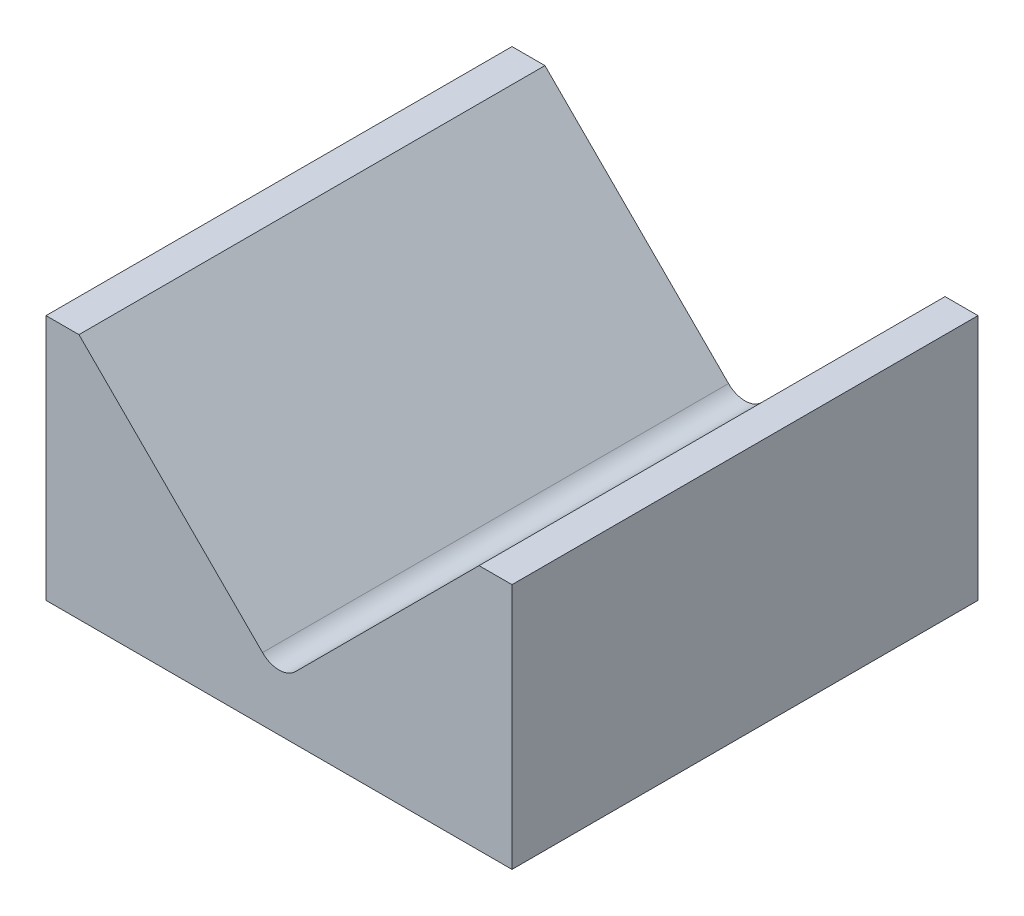
ISO-10303-21;
HEADER;
FILE_DESCRIPTION(('STEP AP214'),'2;1');
FILE_NAME('part.step','',(''),(''),'','','');
FILE_SCHEMA(('AUTOMOTIVE_DESIGN { 1 0 10303 214 1 1 1 1 }'));
ENDSEC;
DATA;
#1=APPLICATION_CONTEXT('core data for automotive mechanical design processes');
#2=APPLICATION_PROTOCOL_DEFINITION('international standard','automotive_design',2000,#1);
#3=PRODUCT_CONTEXT('',#1,'mechanical');
#4=PRODUCT('Part','Part','',(#3));
#5=PRODUCT_RELATED_PRODUCT_CATEGORY('part','',(#4));
#6=PRODUCT_DEFINITION_FORMATION('','',#4);
#7=PRODUCT_DEFINITION_CONTEXT('part definition',#1,'design');
#8=PRODUCT_DEFINITION('design','',#6,#7);
#9=PRODUCT_DEFINITION_SHAPE('','',#8);
#10=(LENGTH_UNIT() NAMED_UNIT(*) SI_UNIT(.MILLI.,.METRE.));
#11=(NAMED_UNIT(*) PLANE_ANGLE_UNIT() SI_UNIT($,.RADIAN.));
#12=(NAMED_UNIT(*) SI_UNIT($,.STERADIAN.) SOLID_ANGLE_UNIT());
#13=UNCERTAINTY_MEASURE_WITH_UNIT(LENGTH_MEASURE(1.E-05),#10,'distance_accuracy_value','');
#14=(GEOMETRIC_REPRESENTATION_CONTEXT(3) GLOBAL_UNCERTAINTY_ASSIGNED_CONTEXT((#13)) GLOBAL_UNIT_ASSIGNED_CONTEXT((#10,
#11,#12)) REPRESENTATION_CONTEXT('',''));
#15=CARTESIAN_POINT('',(0.,0.,0.));
#16=DIRECTION('',(0.,0.,1.));
#17=DIRECTION('',(1.,0.,0.));
#18=AXIS2_PLACEMENT_3D('',#15,#16,#17);
#19=CARTESIAN_POINT('',(10.,0.,10.));
#20=DIRECTION('',(0.,1.,0.));
#21=DIRECTION('',(0.,0.,1.));
#22=AXIS2_PLACEMENT_3D('',#19,#20,#21);
#23=PLANE('',#22);
#24=DIRECTION('',(1.,0.,0.));
#25=VECTOR('',#24,1.);
#26=CARTESIAN_POINT('',(10.,0.,0.));
#27=LINE('',#26,#25);
#28=CARTESIAN_POINT('',(0.,0.,0.));
#29=VERTEX_POINT('',#28);
#30=CARTESIAN_POINT('',(10.,0.,0.));
#31=VERTEX_POINT('',#30);
#32=EDGE_CURVE('E117',#29,#31,#27,.T.);
#33=ORIENTED_EDGE('',*,*,#32,.T.);
#34=DIRECTION('',(0.,0.,-1.));
#35=VECTOR('',#34,1.);
#36=CARTESIAN_POINT('',(10.,0.,10.));
#37=LINE('',#36,#35);
#38=CARTESIAN_POINT('',(10.,0.,10.));
#39=VERTEX_POINT('',#38);
#40=EDGE_CURVE('E101',#39,#31,#37,.T.);
#41=ORIENTED_EDGE('',*,*,#40,.F.);
#42=DIRECTION('',(1.,0.,0.));
#43=VECTOR('',#42,1.);
#44=CARTESIAN_POINT('',(10.,0.,10.));
#45=LINE('',#44,#43);
#46=CARTESIAN_POINT('',(0.,0.,10.));
#47=VERTEX_POINT('',#46);
#48=EDGE_CURVE('E104',#47,#39,#45,.T.);
#49=ORIENTED_EDGE('',*,*,#48,.F.);
#50=DIRECTION('',(0.,0.,-1.));
#51=VECTOR('',#50,1.);
#52=CARTESIAN_POINT('',(0.,0.,10.));
#53=LINE('',#52,#51);
#54=EDGE_CURVE('E119',#47,#29,#53,.T.);
#55=ORIENTED_EDGE('',*,*,#54,.T.);
#56=EDGE_LOOP('',(#33,#41,#49,#55));
#57=FACE_BOUND('',#56,.T.);
#58=ADVANCED_FACE('F35',(#57),#23,.F.);
#59=CARTESIAN_POINT('',(10.,6.,10.));
#60=DIRECTION('',(-1.,0.,0.));
#61=DIRECTION('',(0.,0.,1.));
#62=AXIS2_PLACEMENT_3D('',#59,#60,#61);
#63=PLANE('',#62);
#64=DIRECTION('',(0.,1.,0.));
#65=VECTOR('',#64,1.);
#66=CARTESIAN_POINT('',(10.,6.,0.));
#67=LINE('',#66,#65);
#68=CARTESIAN_POINT('',(10.,5.29289321881345,0.));
#69=VERTEX_POINT('',#68);
#70=EDGE_CURVE('E158',#31,#69,#67,.T.);
#71=ORIENTED_EDGE('',*,*,#70,.T.);
#72=DIRECTION('',(0.,0.,1.));
#73=VECTOR('',#72,1.);
#74=CARTESIAN_POINT('',(10.,5.29289321881345,10.));
#75=LINE('',#74,#73);
#76=CARTESIAN_POINT('',(10.,5.29289321881345,10.));
#77=VERTEX_POINT('',#76);
#78=EDGE_CURVE('E11',#69,#77,#75,.T.);
#79=ORIENTED_EDGE('',*,*,#78,.T.);
#80=DIRECTION('',(0.,1.,0.));
#81=VECTOR('',#80,1.);
#82=CARTESIAN_POINT('',(10.,6.,10.));
#83=LINE('',#82,#81);
#84=EDGE_CURVE('E97',#39,#77,#83,.T.);
#85=ORIENTED_EDGE('',*,*,#84,.F.);
#86=ORIENTED_EDGE('',*,*,#40,.T.);
#87=EDGE_LOOP('',(#71,#79,#85,#86));
#88=FACE_BOUND('',#87,.T.);
#89=ADVANCED_FACE('F99',(#88),#63,.F.);
#90=CARTESIAN_POINT('',(5.,1.,10.));
#91=DIRECTION('',(0.707106781186548,-0.707106781186548,0.));
#92=DIRECTION('',(0.707106781186548,0.707106781186548,0.));
#93=AXIS2_PLACEMENT_3D('',#90,#91,#92);
#94=PLANE('',#93);
#95=DIRECTION('',(-0.707106781186548,-0.707106781186548,0.));
#96=VECTOR('',#95,1.);
#97=CARTESIAN_POINT('',(5.,1.,10.));
#98=LINE('',#97,#96);
#99=CARTESIAN_POINT('',(9.29289321881345,5.29289321881345,10.));
#100=VERTEX_POINT('',#99);
#101=CARTESIAN_POINT('',(5.35355339059327,1.35355339059327,10.));
#102=VERTEX_POINT('',#101);
#103=EDGE_CURVE('E103',#100,#102,#98,.T.);
#104=ORIENTED_EDGE('',*,*,#103,.F.);
#105=DIRECTION('',(0.,0.,-1.));
#106=VECTOR('',#105,1.);
#107=CARTESIAN_POINT('',(9.29289321881345,5.29289321881345,10.));
#108=LINE('',#107,#106);
#109=CARTESIAN_POINT('',(9.29289321881345,5.29289321881345,0.));
#110=VERTEX_POINT('',#109);
#111=EDGE_CURVE('E43',#100,#110,#108,.T.);
#112=ORIENTED_EDGE('',*,*,#111,.T.);
#113=DIRECTION('',(-0.707106781186548,-0.707106781186548,0.));
#114=VECTOR('',#113,1.);
#115=CARTESIAN_POINT('',(5.,1.,0.));
#116=LINE('',#115,#114);
#117=CARTESIAN_POINT('',(5.35355339059327,1.35355339059327,0.));
#118=VERTEX_POINT('',#117);
#119=EDGE_CURVE('E150',#110,#118,#116,.T.);
#120=ORIENTED_EDGE('',*,*,#119,.T.);
#121=DIRECTION('',(0.,0.,-1.));
#122=VECTOR('',#121,1.);
#123=CARTESIAN_POINT('',(5.35355339059327,1.35355339059327,10.));
#124=LINE('',#123,#122);
#125=EDGE_CURVE('E122',#118,#102,#124,.F.);
#126=ORIENTED_EDGE('',*,*,#125,.T.);
#127=EDGE_LOOP('',(#104,#112,#120,#126));
#128=FACE_BOUND('',#127,.T.);
#129=ADVANCED_FACE('F149',(#128),#94,.F.);
#130=CARTESIAN_POINT('',(0.,6.,10.));
#131=DIRECTION('',(-0.707106781186548,-0.707106781186548,0.));
#132=DIRECTION('',(0.707106781186548,-0.707106781186548,0.));
#133=AXIS2_PLACEMENT_3D('',#130,#131,#132);
#134=PLANE('',#133);
#135=DIRECTION('',(-0.707106781186548,0.707106781186548,0.));
#136=VECTOR('',#135,1.);
#137=CARTESIAN_POINT('',(0.,6.,0.));
#138=LINE('',#137,#136);
#139=CARTESIAN_POINT('',(4.64644660940673,1.35355339059327,0.));
#140=VERTEX_POINT('',#139);
#141=CARTESIAN_POINT('',(0.707106781186552,5.29289321881345,0.));
#142=VERTEX_POINT('',#141);
#143=EDGE_CURVE('E157',#140,#142,#138,.T.);
#144=ORIENTED_EDGE('',*,*,#143,.T.);
#145=DIRECTION('',(0.,0.,1.));
#146=VECTOR('',#145,1.);
#147=CARTESIAN_POINT('',(0.707106781186552,5.29289321881345,10.));
#148=LINE('',#147,#146);
#149=CARTESIAN_POINT('',(0.707106781186552,5.29289321881345,10.));
#150=VERTEX_POINT('',#149);
#151=EDGE_CURVE('E141',#142,#150,#148,.T.);
#152=ORIENTED_EDGE('',*,*,#151,.T.);
#153=DIRECTION('',(-0.707106781186548,0.707106781186548,0.));
#154=VECTOR('',#153,1.);
#155=CARTESIAN_POINT('',(0.,6.,10.));
#156=LINE('',#155,#154);
#157=CARTESIAN_POINT('',(4.64644660940673,1.35355339059327,10.));
#158=VERTEX_POINT('',#157);
#159=EDGE_CURVE('E169',#158,#150,#156,.T.);
#160=ORIENTED_EDGE('',*,*,#159,.F.);
#161=DIRECTION('',(0.,0.,-1.));
#162=VECTOR('',#161,1.);
#163=CARTESIAN_POINT('',(4.64644660940673,1.35355339059327,0.));
#164=LINE('',#163,#162);
#165=EDGE_CURVE('E118',#158,#140,#164,.T.);
#166=ORIENTED_EDGE('',*,*,#165,.T.);
#167=EDGE_LOOP('',(#144,#152,#160,#166));
#168=FACE_BOUND('',#167,.T.);
#169=ADVANCED_FACE('F177',(#168),#134,.F.);
#170=CARTESIAN_POINT('',(0.,0.,10.));
#171=DIRECTION('',(1.,0.,0.));
#172=DIRECTION('',(0.,0.,-1.));
#173=AXIS2_PLACEMENT_3D('',#170,#171,#172);
#174=PLANE('',#173);
#175=DIRECTION('',(0.,-1.,0.));
#176=VECTOR('',#175,1.);
#177=CARTESIAN_POINT('',(0.,0.,10.));
#178=LINE('',#177,#176);
#179=CARTESIAN_POINT('',(0.,5.29289321881345,10.));
#180=VERTEX_POINT('',#179);
#181=EDGE_CURVE('E110',#180,#47,#178,.T.);
#182=ORIENTED_EDGE('',*,*,#181,.F.);
#183=DIRECTION('',(0.,0.,-1.));
#184=VECTOR('',#183,1.);
#185=CARTESIAN_POINT('',(0.,5.29289321881345,10.));
#186=LINE('',#185,#184);
#187=CARTESIAN_POINT('',(0.,5.29289321881345,0.));
#188=VERTEX_POINT('',#187);
#189=EDGE_CURVE('E134',#180,#188,#186,.T.);
#190=ORIENTED_EDGE('',*,*,#189,.T.);
#191=DIRECTION('',(0.,-1.,0.));
#192=VECTOR('',#191,1.);
#193=CARTESIAN_POINT('',(0.,0.,0.));
#194=LINE('',#193,#192);
#195=EDGE_CURVE('E114',#188,#29,#194,.T.);
#196=ORIENTED_EDGE('',*,*,#195,.T.);
#197=ORIENTED_EDGE('',*,*,#54,.F.);
#198=EDGE_LOOP('',(#182,#190,#196,#197));
#199=FACE_BOUND('',#198,.T.);
#200=ADVANCED_FACE('F165',(#199),#174,.F.);
#201=CARTESIAN_POINT('',(0.,0.,10.));
#202=DIRECTION('',(0.,0.,-1.));
#203=DIRECTION('',(-1.,0.,0.));
#204=AXIS2_PLACEMENT_3D('',#201,#202,#203);
#205=PLANE('',#204);
#206=ORIENTED_EDGE('',*,*,#159,.T.);
#207=DIRECTION('',(1.,0.,0.));
#208=VECTOR('',#207,1.);
#209=CARTESIAN_POINT('',(0.,5.29289321881345,10.));
#210=LINE('',#209,#208);
#211=EDGE_CURVE('E144',#150,#180,#210,.F.);
#212=ORIENTED_EDGE('',*,*,#211,.T.);
#213=ORIENTED_EDGE('',*,*,#181,.T.);
#214=ORIENTED_EDGE('',*,*,#48,.T.);
#215=ORIENTED_EDGE('',*,*,#84,.T.);
#216=DIRECTION('',(1.,0.,0.));
#217=VECTOR('',#216,1.);
#218=CARTESIAN_POINT('',(9.29289321881345,5.29289321881345,10.));
#219=LINE('',#218,#217);
#220=EDGE_CURVE('E50',#77,#100,#219,.F.);
#221=ORIENTED_EDGE('',*,*,#220,.T.);
#222=ORIENTED_EDGE('',*,*,#103,.T.);
#223=CARTESIAN_POINT('',(5.,1.70710678118655,10.));
#224=DIRECTION('',(0.,0.,-1.));
#225=DIRECTION('',(-1.,0.,0.));
#226=AXIS2_PLACEMENT_3D('',#223,#224,#225);
#227=CIRCLE('',#226,0.5);
#228=EDGE_CURVE('E132',#102,#158,#227,.T.);
#229=ORIENTED_EDGE('',*,*,#228,.T.);
#230=EDGE_LOOP('',(#206,#212,#213,#214,#215,#221,#222,#229));
#231=FACE_BOUND('',#230,.T.);
#232=ADVANCED_FACE('F108',(#231),#205,.F.);
#233=CARTESIAN_POINT('',(0.,0.,0.));
#234=DIRECTION('',(0.,0.,-1.));
#235=DIRECTION('',(-1.,0.,0.));
#236=AXIS2_PLACEMENT_3D('',#233,#234,#235);
#237=PLANE('',#236);
#238=ORIENTED_EDGE('',*,*,#195,.F.);
#239=DIRECTION('',(-1.,0.,0.));
#240=VECTOR('',#239,1.);
#241=CARTESIAN_POINT('',(0.,5.29289321881345,0.));
#242=LINE('',#241,#240);
#243=EDGE_CURVE('E139',#188,#142,#242,.F.);
#244=ORIENTED_EDGE('',*,*,#243,.T.);
#245=ORIENTED_EDGE('',*,*,#143,.F.);
#246=CARTESIAN_POINT('',(5.,1.70710678118655,0.));
#247=DIRECTION('',(0.,0.,-1.));
#248=DIRECTION('',(-1.,0.,0.));
#249=AXIS2_PLACEMENT_3D('',#246,#247,#248);
#250=CIRCLE('',#249,0.5);
#251=EDGE_CURVE('E129',#140,#118,#250,.F.);
#252=ORIENTED_EDGE('',*,*,#251,.T.);
#253=ORIENTED_EDGE('',*,*,#119,.F.);
#254=DIRECTION('',(-1.,0.,0.));
#255=VECTOR('',#254,1.);
#256=CARTESIAN_POINT('',(0.,5.29289321881347,0.));
#257=LINE('',#256,#255);
#258=EDGE_CURVE('E137',#110,#69,#257,.F.);
#259=ORIENTED_EDGE('',*,*,#258,.T.);
#260=ORIENTED_EDGE('',*,*,#70,.F.);
#261=ORIENTED_EDGE('',*,*,#32,.F.);
#262=EDGE_LOOP('',(#238,#244,#245,#252,#253,#259,#260,#261));
#263=FACE_BOUND('',#262,.T.);
#264=ADVANCED_FACE('F154',(#263),#237,.T.);
#265=CARTESIAN_POINT('',(5.,1.70710678118655,10.));
#266=DIRECTION('',(0.,0.,1.));
#267=DIRECTION('',(1.,0.,0.));
#268=AXIS2_PLACEMENT_3D('',#265,#266,#267);
#269=CYLINDRICAL_SURFACE('',#268,0.5);
#270=ORIENTED_EDGE('',*,*,#228,.F.);
#271=ORIENTED_EDGE('',*,*,#125,.F.);
#272=ORIENTED_EDGE('',*,*,#251,.F.);
#273=ORIENTED_EDGE('',*,*,#165,.F.);
#274=EDGE_LOOP('',(#270,#271,#272,#273));
#275=FACE_BOUND('',#274,.T.);
#276=ADVANCED_FACE('F175',(#275),#269,.F.);
#277=CARTESIAN_POINT('',(0.,5.29289321881345,10.));
#278=DIRECTION('',(0.,-1.,0.));
#279=DIRECTION('',(0.,0.,-1.));
#280=AXIS2_PLACEMENT_3D('',#277,#278,#279);
#281=PLANE('',#280);
#282=ORIENTED_EDGE('',*,*,#211,.F.);
#283=ORIENTED_EDGE('',*,*,#151,.F.);
#284=ORIENTED_EDGE('',*,*,#243,.F.);
#285=ORIENTED_EDGE('',*,*,#189,.F.);
#286=EDGE_LOOP('',(#282,#283,#284,#285));
#287=FACE_BOUND('',#286,.T.);
#288=ADVANCED_FACE('F181',(#287),#281,.F.);
#289=CARTESIAN_POINT('',(9.29289321881345,5.29289321881345,10.));
#290=DIRECTION('',(0.,-1.,0.));
#291=DIRECTION('',(0.,0.,-1.));
#292=AXIS2_PLACEMENT_3D('',#289,#290,#291);
#293=PLANE('',#292);
#294=ORIENTED_EDGE('',*,*,#220,.F.);
#295=ORIENTED_EDGE('',*,*,#78,.F.);
#296=ORIENTED_EDGE('',*,*,#258,.F.);
#297=ORIENTED_EDGE('',*,*,#111,.F.);
#298=EDGE_LOOP('',(#294,#295,#296,#297));
#299=FACE_BOUND('',#298,.T.);
#300=ADVANCED_FACE('F37',(#299),#293,.F.);
#301=CLOSED_SHELL('',(#58,#89,#129,#169,#200,#232,#264,#276,#288,#300));
#302=MANIFOLD_SOLID_BREP('B2',#301);
#303=ADVANCED_BREP_SHAPE_REPRESENTATION('',(#18,#302),#14);
#304=SHAPE_DEFINITION_REPRESENTATION(#9,#303);
ENDSEC;
END-ISO-10303-21;
